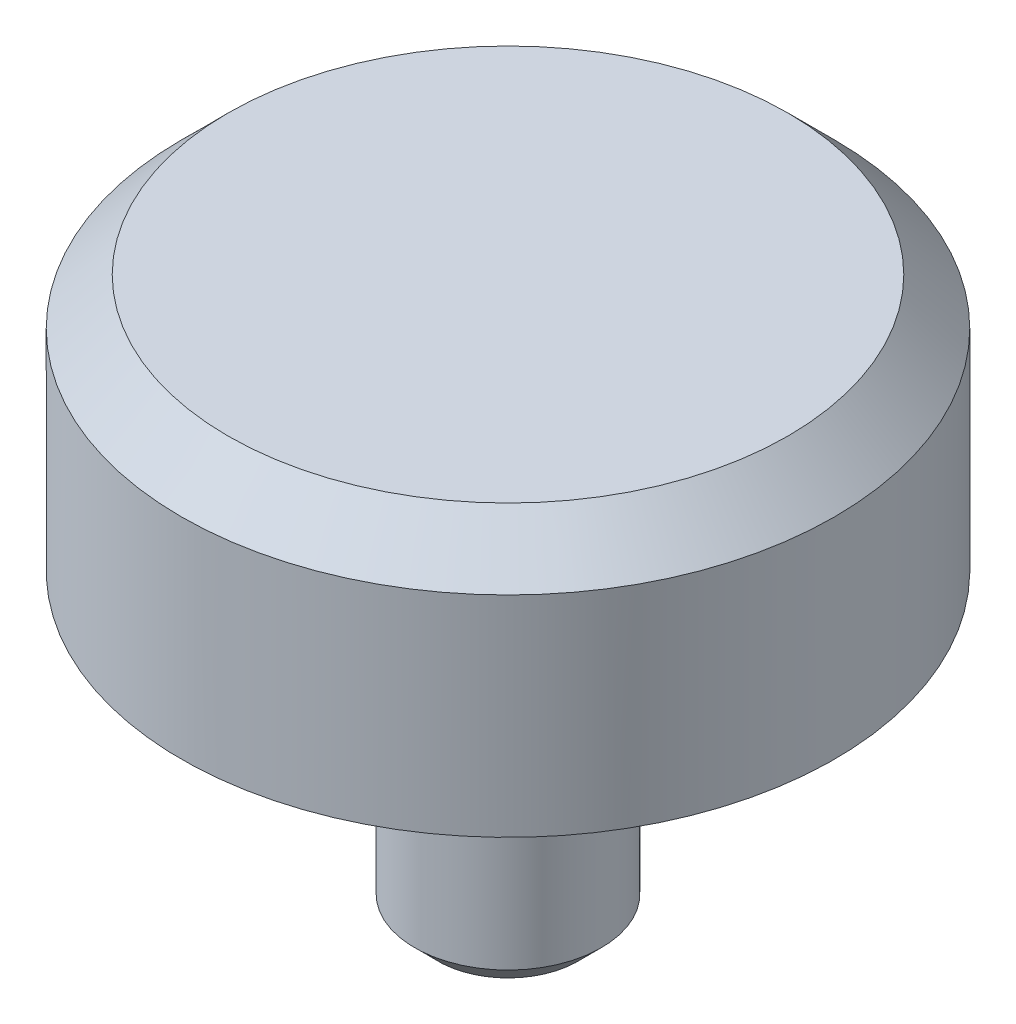
ISO-10303-21;
HEADER;
FILE_DESCRIPTION(('STEP AP214'),'2;1');
FILE_NAME('part.step','',(''),(''),'','','');
FILE_SCHEMA(('AUTOMOTIVE_DESIGN { 1 0 10303 214 1 1 1 1 }'));
ENDSEC;
DATA;
#1=APPLICATION_CONTEXT('core data for automotive mechanical design processes');
#2=APPLICATION_PROTOCOL_DEFINITION('international standard','automotive_design',2000,#1);
#3=PRODUCT_CONTEXT('',#1,'mechanical');
#4=PRODUCT('Part','Part','',(#3));
#5=PRODUCT_RELATED_PRODUCT_CATEGORY('part','',(#4));
#6=PRODUCT_DEFINITION_FORMATION('','',#4);
#7=PRODUCT_DEFINITION_CONTEXT('part definition',#1,'design');
#8=PRODUCT_DEFINITION('design','',#6,#7);
#9=PRODUCT_DEFINITION_SHAPE('','',#8);
#10=(LENGTH_UNIT() NAMED_UNIT(*) SI_UNIT(.MILLI.,.METRE.));
#11=(NAMED_UNIT(*) PLANE_ANGLE_UNIT() SI_UNIT($,.RADIAN.));
#12=(NAMED_UNIT(*) SI_UNIT($,.STERADIAN.) SOLID_ANGLE_UNIT());
#13=UNCERTAINTY_MEASURE_WITH_UNIT(LENGTH_MEASURE(1.E-05),#10,'distance_accuracy_value','');
#14=(GEOMETRIC_REPRESENTATION_CONTEXT(3) GLOBAL_UNCERTAINTY_ASSIGNED_CONTEXT((#13)) GLOBAL_UNIT_ASSIGNED_CONTEXT((#10,
#11,#12)) REPRESENTATION_CONTEXT('',''));
#15=CARTESIAN_POINT('',(0.,0.,0.));
#16=DIRECTION('',(0.,0.,1.));
#17=DIRECTION('',(1.,0.,0.));
#18=AXIS2_PLACEMENT_3D('',#15,#16,#17);
#19=CARTESIAN_POINT('',(0.,0.,0.));
#20=DIRECTION('',(0.,-1.,0.));
#21=DIRECTION('',(0.,0.,-1.));
#22=AXIS2_PLACEMENT_3D('',#19,#20,#21);
#23=PLANE('',#22);
#24=CARTESIAN_POINT('',(0.,0.,0.));
#25=DIRECTION('',(0.,-1.,0.));
#26=DIRECTION('',(0.,0.,-1.));
#27=AXIS2_PLACEMENT_3D('',#24,#25,#26);
#28=CIRCLE('',#27,3.);
#29=CARTESIAN_POINT('',(0.,0.,-3.));
#30=VERTEX_POINT('',#29);
#31=EDGE_CURVE('E51',#30,#30,#28,.T.);
#32=ORIENTED_EDGE('',*,*,#31,.T.);
#33=EDGE_LOOP('',(#32));
#34=FACE_BOUND('',#33,.T.);
#35=ADVANCED_FACE('F42',(#34),#23,.T.);
#36=CARTESIAN_POINT('',(0.,0.,0.));
#37=DIRECTION('',(0.,-1.,0.));
#38=DIRECTION('',(0.,0.,-1.));
#39=AXIS2_PLACEMENT_3D('',#36,#37,#38);
#40=CYLINDRICAL_SURFACE('',#39,4.);
#41=CARTESIAN_POINT('',(0.,1.00000000000001,0.));
#42=DIRECTION('',(0.,-1.,0.));
#43=DIRECTION('',(0.,0.,-1.));
#44=AXIS2_PLACEMENT_3D('',#41,#42,#43);
#45=CIRCLE('',#44,4.);
#46=CARTESIAN_POINT('',(0.,1.00000000000001,-4.));
#47=VERTEX_POINT('',#46);
#48=EDGE_CURVE('E10',#47,#47,#45,.F.);
#49=ORIENTED_EDGE('',*,*,#48,.T.);
#50=EDGE_LOOP('',(#49));
#51=FACE_BOUND('',#50,.T.);
#52=CARTESIAN_POINT('',(0.,12.,0.));
#53=DIRECTION('',(0.,-1.,0.));
#54=DIRECTION('',(0.,0.,-1.));
#55=AXIS2_PLACEMENT_3D('',#52,#53,#54);
#56=CIRCLE('',#55,4.);
#57=CARTESIAN_POINT('',(0.,12.,-4.));
#58=VERTEX_POINT('',#57);
#59=EDGE_CURVE('E71',#58,#58,#56,.T.);
#60=ORIENTED_EDGE('',*,*,#59,.T.);
#61=EDGE_LOOP('',(#60));
#62=FACE_BOUND('',#61,.T.);
#63=ADVANCED_FACE('F94',(#51,#62),#40,.T.);
#64=CARTESIAN_POINT('',(4.,13.,0.));
#65=DIRECTION('',(0.,-1.,0.));
#66=DIRECTION('',(0.,0.,-1.));
#67=AXIS2_PLACEMENT_3D('',#64,#65,#66);
#68=PLANE('',#67);
#69=CARTESIAN_POINT('',(0.,13.,0.));
#70=DIRECTION('',(0.,-1.,0.));
#71=DIRECTION('',(0.,0.,-1.));
#72=AXIS2_PLACEMENT_3D('',#69,#70,#71);
#73=CIRCLE('',#72,5.);
#74=CARTESIAN_POINT('',(0.,13.,-5.));
#75=VERTEX_POINT('',#74);
#76=EDGE_CURVE('E67',#75,#75,#73,.F.);
#77=ORIENTED_EDGE('',*,*,#76,.T.);
#78=EDGE_LOOP('',(#77));
#79=FACE_BOUND('',#78,.T.);
#80=CARTESIAN_POINT('',(0.,13.,0.));
#81=DIRECTION('',(0.,-1.,0.));
#82=DIRECTION('',(0.,0.,-1.));
#83=AXIS2_PLACEMENT_3D('',#80,#81,#82);
#84=CIRCLE('',#83,14.);
#85=CARTESIAN_POINT('',(0.,13.,-14.));
#86=VERTEX_POINT('',#85);
#87=EDGE_CURVE('E75',#86,#86,#84,.T.);
#88=ORIENTED_EDGE('',*,*,#87,.T.);
#89=EDGE_LOOP('',(#88));
#90=FACE_BOUND('',#89,.T.);
#91=ADVANCED_FACE('F80',(#79,#90),#68,.T.);
#92=CARTESIAN_POINT('',(0.,0.,0.));
#93=DIRECTION('',(0.,-1.,0.));
#94=DIRECTION('',(0.,0.,-1.));
#95=AXIS2_PLACEMENT_3D('',#92,#93,#94);
#96=CYLINDRICAL_SURFACE('',#95,14.);
#97=CARTESIAN_POINT('',(0.,22.,0.));
#98=DIRECTION('',(0.,1.,0.));
#99=DIRECTION('',(0.,0.,1.));
#100=AXIS2_PLACEMENT_3D('',#97,#98,#99);
#101=CIRCLE('',#100,14.);
#102=CARTESIAN_POINT('',(0.,22.,14.));
#103=VERTEX_POINT('',#102);
#104=EDGE_CURVE('E61',#103,#103,#101,.F.);
#105=ORIENTED_EDGE('',*,*,#104,.T.);
#106=EDGE_LOOP('',(#105));
#107=FACE_BOUND('',#106,.T.);
#108=ORIENTED_EDGE('',*,*,#87,.F.);
#109=EDGE_LOOP('',(#108));
#110=FACE_BOUND('',#109,.T.);
#111=ADVANCED_FACE('F82',(#107,#110),#96,.T.);
#112=CARTESIAN_POINT('',(0.,24.,0.));
#113=DIRECTION('',(0.,1.,0.));
#114=DIRECTION('',(0.,0.,1.));
#115=AXIS2_PLACEMENT_3D('',#112,#113,#114);
#116=PLANE('',#115);
#117=CARTESIAN_POINT('',(0.,24.,0.));
#118=DIRECTION('',(0.,1.,0.));
#119=DIRECTION('',(0.,0.,1.));
#120=AXIS2_PLACEMENT_3D('',#117,#118,#119);
#121=CIRCLE('',#120,12.);
#122=CARTESIAN_POINT('',(0.,24.,12.));
#123=VERTEX_POINT('',#122);
#124=EDGE_CURVE('E56',#123,#123,#121,.T.);
#125=ORIENTED_EDGE('',*,*,#124,.T.);
#126=EDGE_LOOP('',(#125));
#127=FACE_BOUND('',#126,.T.);
#128=ADVANCED_FACE('F84',(#127),#116,.T.);
#129=CARTESIAN_POINT('',(0.,12.,0.));
#130=DIRECTION('',(0.,-1.,0.));
#131=DIRECTION('',(0.,0.,-1.));
#132=AXIS2_PLACEMENT_3D('',#129,#130,#131);
#133=TOROIDAL_SURFACE('',#132,5.,1.);
#134=ORIENTED_EDGE('',*,*,#76,.F.);
#135=EDGE_LOOP('',(#134));
#136=FACE_BOUND('',#135,.T.);
#137=ORIENTED_EDGE('',*,*,#59,.F.);
#138=EDGE_LOOP('',(#137));
#139=FACE_BOUND('',#138,.T.);
#140=ADVANCED_FACE('F91',(#136,#139),#133,.F.);
#141=CARTESIAN_POINT('',(0.,22.,0.));
#142=DIRECTION('',(0.,-1.,0.));
#143=DIRECTION('',(0.,0.,-1.));
#144=AXIS2_PLACEMENT_3D('',#141,#142,#143);
#145=CONICAL_SURFACE('',#144,14.,0.785398163397451);
#146=ORIENTED_EDGE('',*,*,#124,.F.);
#147=EDGE_LOOP('',(#146));
#148=FACE_BOUND('',#147,.T.);
#149=ORIENTED_EDGE('',*,*,#104,.F.);
#150=EDGE_LOOP('',(#149));
#151=FACE_BOUND('',#150,.T.);
#152=ADVANCED_FACE('F107',(#148,#151),#145,.T.);
#153=CARTESIAN_POINT('',(0.,0.,0.));
#154=DIRECTION('',(0.,1.,0.));
#155=DIRECTION('',(0.,0.,1.));
#156=AXIS2_PLACEMENT_3D('',#153,#154,#155);
#157=CONICAL_SURFACE('',#156,3.,0.785398163397445);
#158=ORIENTED_EDGE('',*,*,#48,.F.);
#159=EDGE_LOOP('',(#158));
#160=FACE_BOUND('',#159,.T.);
#161=ORIENTED_EDGE('',*,*,#31,.F.);
#162=EDGE_LOOP('',(#161));
#163=FACE_BOUND('',#162,.T.);
#164=ADVANCED_FACE('F45',(#160,#163),#157,.T.);
#165=CLOSED_SHELL('',(#35,#63,#91,#111,#128,#140,#152,#164));
#166=MANIFOLD_SOLID_BREP('B2',#165);
#167=ADVANCED_BREP_SHAPE_REPRESENTATION('',(#18,#166),#14);
#168=SHAPE_DEFINITION_REPRESENTATION(#9,#167);
ENDSEC;
END-ISO-10303-21;
